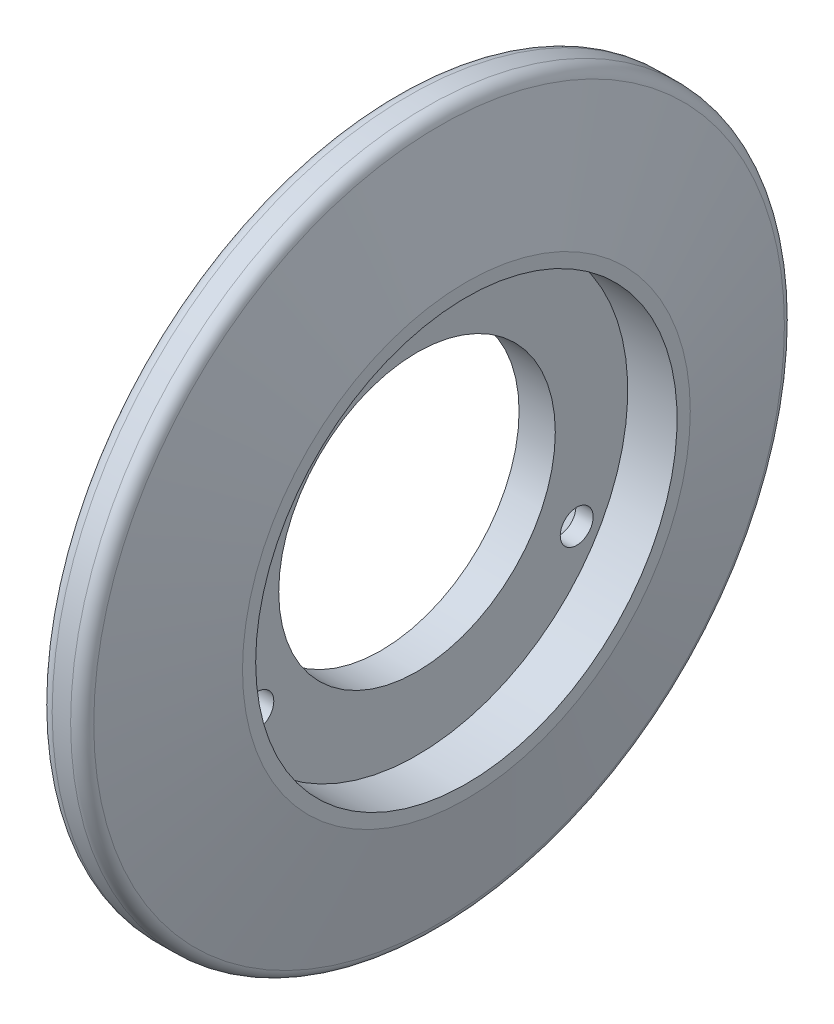
ISO-10303-21;
HEADER;
FILE_DESCRIPTION(('STEP AP214'),'2;1');
FILE_NAME('part.step','',(''),(''),'','','');
FILE_SCHEMA(('AUTOMOTIVE_DESIGN { 1 0 10303 214 1 1 1 1 }'));
ENDSEC;
DATA;
#1=APPLICATION_CONTEXT('core data for automotive mechanical design processes');
#2=APPLICATION_PROTOCOL_DEFINITION('international standard','automotive_design',2000,#1);
#3=PRODUCT_CONTEXT('',#1,'mechanical');
#4=PRODUCT('Part','Part','',(#3));
#5=PRODUCT_RELATED_PRODUCT_CATEGORY('part','',(#4));
#6=PRODUCT_DEFINITION_FORMATION('','',#4);
#7=PRODUCT_DEFINITION_CONTEXT('part definition',#1,'design');
#8=PRODUCT_DEFINITION('design','',#6,#7);
#9=PRODUCT_DEFINITION_SHAPE('','',#8);
#10=(LENGTH_UNIT() NAMED_UNIT(*) SI_UNIT(.MILLI.,.METRE.));
#11=(NAMED_UNIT(*) PLANE_ANGLE_UNIT() SI_UNIT($,.RADIAN.));
#12=(NAMED_UNIT(*) SI_UNIT($,.STERADIAN.) SOLID_ANGLE_UNIT());
#13=UNCERTAINTY_MEASURE_WITH_UNIT(LENGTH_MEASURE(1.E-05),#10,'distance_accuracy_value','');
#14=(GEOMETRIC_REPRESENTATION_CONTEXT(3) GLOBAL_UNCERTAINTY_ASSIGNED_CONTEXT((#13)) GLOBAL_UNIT_ASSIGNED_CONTEXT((#10,
#11,#12)) REPRESENTATION_CONTEXT('',''));
#15=CARTESIAN_POINT('',(0.,0.,0.));
#16=DIRECTION('',(0.,0.,1.));
#17=DIRECTION('',(1.,0.,0.));
#18=AXIS2_PLACEMENT_3D('',#15,#16,#17);
#19=CARTESIAN_POINT('',(5.50000000000002,-33.,0.));
#20=DIRECTION('',(-1.,0.,0.));
#21=DIRECTION('',(0.,0.,1.));
#22=AXIS2_PLACEMENT_3D('',#19,#20,#21);
#23=PLANE('',#22);
#24=CARTESIAN_POINT('',(5.50000000000002,0.,0.));
#25=DIRECTION('',(-1.,0.,0.));
#26=DIRECTION('',(0.,0.,1.));
#27=AXIS2_PLACEMENT_3D('',#24,#25,#26);
#28=CIRCLE('',#27,34.);
#29=CARTESIAN_POINT('',(5.50000000000002,0.,34.));
#30=VERTEX_POINT('',#29);
#31=EDGE_CURVE('E98',#30,#30,#28,.T.);
#32=ORIENTED_EDGE('',*,*,#31,.T.);
#33=EDGE_LOOP('',(#32));
#34=FACE_BOUND('',#33,.T.);
#35=CARTESIAN_POINT('',(5.50000000000002,0.,0.));
#36=DIRECTION('',(-1.,0.,0.));
#37=DIRECTION('',(0.,0.,1.));
#38=AXIS2_PLACEMENT_3D('',#35,#36,#37);
#39=CIRCLE('',#38,33.);
#40=CARTESIAN_POINT('',(5.50000000000002,0.,33.));
#41=VERTEX_POINT('',#40);
#42=EDGE_CURVE('E65',#41,#41,#39,.T.);
#43=ORIENTED_EDGE('',*,*,#42,.F.);
#44=EDGE_LOOP('',(#43));
#45=FACE_BOUND('',#44,.T.);
#46=ADVANCED_FACE('F29',(#34,#45),#23,.T.);
#47=CARTESIAN_POINT('',(5.50000000000002,0.,0.));
#48=DIRECTION('',(1.,0.,0.));
#49=DIRECTION('',(0.,0.,-1.));
#50=AXIS2_PLACEMENT_3D('',#47,#48,#49);
#51=CONICAL_SURFACE('',#50,34.,1.34948188444711);
#52=CARTESIAN_POINT('',(9.64878048780489,0.,0.));
#53=DIRECTION('',(-1.,0.,0.));
#54=DIRECTION('',(0.,0.,1.));
#55=AXIS2_PLACEMENT_3D('',#52,#53,#54);
#56=CIRCLE('',#55,52.4390243902439);
#57=CARTESIAN_POINT('',(9.64878048780489,0.,52.4390243902439));
#58=VERTEX_POINT('',#57);
#59=EDGE_CURVE('E11',#58,#58,#56,.T.);
#60=ORIENTED_EDGE('',*,*,#59,.T.);
#61=EDGE_LOOP('',(#60));
#62=FACE_BOUND('',#61,.T.);
#63=ORIENTED_EDGE('',*,*,#31,.F.);
#64=EDGE_LOOP('',(#63));
#65=FACE_BOUND('',#64,.T.);
#66=ADVANCED_FACE('F145',(#62,#65),#51,.T.);
#67=CARTESIAN_POINT('',(-40.,0.,0.));
#68=DIRECTION('',(-1.,0.,0.));
#69=DIRECTION('',(0.,0.,1.));
#70=AXIS2_PLACEMENT_3D('',#67,#68,#69);
#71=CYLINDRICAL_SURFACE('',#70,54.);
#72=CARTESIAN_POINT('',(14.4,0.,0.));
#73=DIRECTION('',(1.,0.,0.));
#74=DIRECTION('',(0.,0.,-1.));
#75=AXIS2_PLACEMENT_3D('',#72,#73,#74);
#76=CIRCLE('',#75,54.);
#77=CARTESIAN_POINT('',(14.4,0.,-54.));
#78=VERTEX_POINT('',#77);
#79=EDGE_CURVE('E104',#78,#78,#76,.F.);
#80=ORIENTED_EDGE('',*,*,#79,.T.);
#81=EDGE_LOOP('',(#80));
#82=FACE_BOUND('',#81,.T.);
#83=CARTESIAN_POINT('',(11.6,0.,0.));
#84=DIRECTION('',(1.,0.,0.));
#85=DIRECTION('',(0.,0.,-1.));
#86=AXIS2_PLACEMENT_3D('',#83,#84,#85);
#87=CIRCLE('',#86,54.);
#88=CARTESIAN_POINT('',(11.6,0.,-54.));
#89=VERTEX_POINT('',#88);
#90=EDGE_CURVE('E101',#89,#89,#87,.T.);
#91=ORIENTED_EDGE('',*,*,#90,.T.);
#92=EDGE_LOOP('',(#91));
#93=FACE_BOUND('',#92,.T.);
#94=ADVANCED_FACE('F139',(#82,#93),#71,.T.);
#95=CARTESIAN_POINT('',(16.,0.,0.));
#96=DIRECTION('',(-1.,0.,0.));
#97=DIRECTION('',(0.,0.,1.));
#98=AXIS2_PLACEMENT_3D('',#95,#96,#97);
#99=CONICAL_SURFACE('',#98,54.,1.34948188444711);
#100=CARTESIAN_POINT('',(16.3512195121951,0.,0.));
#101=DIRECTION('',(1.,0.,0.));
#102=DIRECTION('',(0.,0.,-1.));
#103=AXIS2_PLACEMENT_3D('',#100,#101,#102);
#104=CIRCLE('',#103,52.4390243902439);
#105=CARTESIAN_POINT('',(16.3512195121951,0.,-52.4390243902439));
#106=VERTEX_POINT('',#105);
#107=EDGE_CURVE('E37',#106,#106,#104,.T.);
#108=ORIENTED_EDGE('',*,*,#107,.T.);
#109=EDGE_LOOP('',(#108));
#110=FACE_BOUND('',#109,.T.);
#111=CARTESIAN_POINT('',(20.5,0.,0.));
#112=DIRECTION('',(-1.,0.,0.));
#113=DIRECTION('',(0.,0.,1.));
#114=AXIS2_PLACEMENT_3D('',#111,#112,#113);
#115=CIRCLE('',#114,34.);
#116=CARTESIAN_POINT('',(20.5,0.,34.));
#117=VERTEX_POINT('',#116);
#118=EDGE_CURVE('E95',#117,#117,#115,.T.);
#119=ORIENTED_EDGE('',*,*,#118,.T.);
#120=EDGE_LOOP('',(#119));
#121=FACE_BOUND('',#120,.T.);
#122=ADVANCED_FACE('F134',(#110,#121),#99,.T.);
#123=CARTESIAN_POINT('',(20.5,-34.,0.));
#124=DIRECTION('',(1.,0.,0.));
#125=DIRECTION('',(0.,0.,-1.));
#126=AXIS2_PLACEMENT_3D('',#123,#124,#125);
#127=PLANE('',#126);
#128=CARTESIAN_POINT('',(20.5,0.,0.));
#129=DIRECTION('',(-1.,0.,0.));
#130=DIRECTION('',(0.,0.,1.));
#131=AXIS2_PLACEMENT_3D('',#128,#129,#130);
#132=CIRCLE('',#131,32.);
#133=CARTESIAN_POINT('',(20.5,0.,32.));
#134=VERTEX_POINT('',#133);
#135=EDGE_CURVE('E92',#134,#134,#132,.T.);
#136=ORIENTED_EDGE('',*,*,#135,.T.);
#137=EDGE_LOOP('',(#136));
#138=FACE_BOUND('',#137,.T.);
#139=ORIENTED_EDGE('',*,*,#118,.F.);
#140=EDGE_LOOP('',(#139));
#141=FACE_BOUND('',#140,.T.);
#142=ADVANCED_FACE('F128',(#138,#141),#127,.T.);
#143=CARTESIAN_POINT('',(-40.,0.,0.));
#144=DIRECTION('',(-1.,0.,0.));
#145=DIRECTION('',(0.,0.,1.));
#146=AXIS2_PLACEMENT_3D('',#143,#144,#145);
#147=CYLINDRICAL_SURFACE('',#146,32.);
#148=CARTESIAN_POINT('',(13.,0.,0.));
#149=DIRECTION('',(-1.,0.,0.));
#150=DIRECTION('',(0.,0.,1.));
#151=AXIS2_PLACEMENT_3D('',#148,#149,#150);
#152=CIRCLE('',#151,32.);
#153=CARTESIAN_POINT('',(13.,0.,32.));
#154=VERTEX_POINT('',#153);
#155=EDGE_CURVE('E89',#154,#154,#152,.T.);
#156=ORIENTED_EDGE('',*,*,#155,.T.);
#157=EDGE_LOOP('',(#156));
#158=FACE_BOUND('',#157,.T.);
#159=ORIENTED_EDGE('',*,*,#135,.F.);
#160=EDGE_LOOP('',(#159));
#161=FACE_BOUND('',#160,.T.);
#162=ADVANCED_FACE('F119',(#158,#161),#147,.F.);
#163=CARTESIAN_POINT('',(13.,-32.,0.));
#164=DIRECTION('',(1.,0.,0.));
#165=DIRECTION('',(0.,0.,-1.));
#166=AXIS2_PLACEMENT_3D('',#163,#164,#165);
#167=PLANE('',#166);
#168=CARTESIAN_POINT('',(13.0000000000001,-13.9999999999998,24.2487113059644));
#169=DIRECTION('',(1.,0.,0.));
#170=DIRECTION('',(0.,0.,-1.));
#171=AXIS2_PLACEMENT_3D('',#168,#169,#170);
#172=CIRCLE('',#171,2.50000000000001);
#173=CARTESIAN_POINT('',(13.0000000000001,-13.9999999999998,21.7487113059644));
#174=VERTEX_POINT('',#173);
#175=EDGE_CURVE('E32',#174,#174,#172,.T.);
#176=ORIENTED_EDGE('',*,*,#175,.F.);
#177=EDGE_LOOP('',(#176));
#178=FACE_BOUND('',#177,.T.);
#179=CARTESIAN_POINT('',(13.,-14.0000000000001,-24.2487113059642));
#180=DIRECTION('',(1.,0.,0.));
#181=DIRECTION('',(0.,0.,-1.));
#182=AXIS2_PLACEMENT_3D('',#179,#180,#181);
#183=CIRCLE('',#182,2.50000000000001);
#184=CARTESIAN_POINT('',(13.,-14.0000000000001,-26.7487113059642));
#185=VERTEX_POINT('',#184);
#186=EDGE_CURVE('E71',#185,#185,#183,.T.);
#187=ORIENTED_EDGE('',*,*,#186,.F.);
#188=EDGE_LOOP('',(#187));
#189=FACE_BOUND('',#188,.T.);
#190=CARTESIAN_POINT('',(13.,28.,0.));
#191=DIRECTION('',(1.,0.,0.));
#192=DIRECTION('',(0.,0.,-1.));
#193=AXIS2_PLACEMENT_3D('',#190,#191,#192);
#194=CIRCLE('',#193,2.50000000000001);
#195=CARTESIAN_POINT('',(13.,28.,-2.50000000000001));
#196=VERTEX_POINT('',#195);
#197=EDGE_CURVE('E74',#196,#196,#194,.T.);
#198=ORIENTED_EDGE('',*,*,#197,.F.);
#199=EDGE_LOOP('',(#198));
#200=FACE_BOUND('',#199,.T.);
#201=CARTESIAN_POINT('',(13.,0.,0.));
#202=DIRECTION('',(-1.,0.,0.));
#203=DIRECTION('',(0.,0.,1.));
#204=AXIS2_PLACEMENT_3D('',#201,#202,#203);
#205=CIRCLE('',#204,21.);
#206=CARTESIAN_POINT('',(13.,0.,21.));
#207=VERTEX_POINT('',#206);
#208=EDGE_CURVE('E86',#207,#207,#205,.T.);
#209=ORIENTED_EDGE('',*,*,#208,.T.);
#210=EDGE_LOOP('',(#209));
#211=FACE_BOUND('',#210,.T.);
#212=ORIENTED_EDGE('',*,*,#155,.F.);
#213=EDGE_LOOP('',(#212));
#214=FACE_BOUND('',#213,.T.);
#215=ADVANCED_FACE('F115',(#178,#189,#200,#211,#214),#167,.T.);
#216=CARTESIAN_POINT('',(-40.,0.,0.));
#217=DIRECTION('',(-1.,0.,0.));
#218=DIRECTION('',(0.,0.,1.));
#219=AXIS2_PLACEMENT_3D('',#216,#217,#218);
#220=CYLINDRICAL_SURFACE('',#219,21.);
#221=CARTESIAN_POINT('',(7.50000000000002,0.,0.));
#222=DIRECTION('',(-1.,0.,0.));
#223=DIRECTION('',(0.,0.,1.));
#224=AXIS2_PLACEMENT_3D('',#221,#222,#223);
#225=CIRCLE('',#224,21.);
#226=CARTESIAN_POINT('',(7.50000000000002,0.,21.));
#227=VERTEX_POINT('',#226);
#228=EDGE_CURVE('E83',#227,#227,#225,.T.);
#229=ORIENTED_EDGE('',*,*,#228,.T.);
#230=EDGE_LOOP('',(#229));
#231=FACE_BOUND('',#230,.T.);
#232=ORIENTED_EDGE('',*,*,#208,.F.);
#233=EDGE_LOOP('',(#232));
#234=FACE_BOUND('',#233,.T.);
#235=ADVANCED_FACE('F118',(#231,#234),#220,.F.);
#236=CARTESIAN_POINT('',(7.50000000000001,-21.,0.));
#237=DIRECTION('',(-1.,0.,0.));
#238=DIRECTION('',(0.,0.,1.));
#239=AXIS2_PLACEMENT_3D('',#236,#237,#238);
#240=PLANE('',#239);
#241=CARTESIAN_POINT('',(7.50000000000002,0.,0.));
#242=DIRECTION('',(-1.,0.,0.));
#243=DIRECTION('',(0.,0.,1.));
#244=AXIS2_PLACEMENT_3D('',#241,#242,#243);
#245=CIRCLE('',#244,33.);
#246=CARTESIAN_POINT('',(7.50000000000002,-16.5000000000001,-28.5788383248864));
#247=VERTEX_POINT('',#246);
#248=CARTESIAN_POINT('',(7.50000000000001,-16.4999999999997,28.5788383248866));
#249=VERTEX_POINT('',#248);
#250=EDGE_CURVE('E64',#247,#249,#245,.T.);
#251=ORIENTED_EDGE('',*,*,#250,.T.);
#252=CARTESIAN_POINT('',(7.50000000000005,-13.9999999999998,24.2487113059644));
#253=DIRECTION('',(-1.,0.,0.));
#254=DIRECTION('',(0.,0.,1.));
#255=AXIS2_PLACEMENT_3D('',#252,#253,#254);
#256=CIRCLE('',#255,5.);
#257=EDGE_CURVE('E43',#249,#249,#256,.T.);
#258=ORIENTED_EDGE('',*,*,#257,.F.);
#259=CARTESIAN_POINT('',(7.50000000000002,33.,0.));
#260=VERTEX_POINT('',#259);
#261=EDGE_CURVE('E54',#249,#260,#245,.T.);
#262=ORIENTED_EDGE('',*,*,#261,.T.);
#263=CARTESIAN_POINT('',(7.50000000000001,28.,0.));
#264=DIRECTION('',(-1.,0.,0.));
#265=DIRECTION('',(0.,0.,1.));
#266=AXIS2_PLACEMENT_3D('',#263,#264,#265);
#267=CIRCLE('',#266,5.);
#268=EDGE_CURVE('E60',#260,#260,#267,.T.);
#269=ORIENTED_EDGE('',*,*,#268,.F.);
#270=EDGE_CURVE('E67',#260,#247,#245,.T.);
#271=ORIENTED_EDGE('',*,*,#270,.T.);
#272=CARTESIAN_POINT('',(7.50000000000001,-14.0000000000001,-24.2487113059642));
#273=DIRECTION('',(-1.,0.,0.));
#274=DIRECTION('',(0.,0.,1.));
#275=AXIS2_PLACEMENT_3D('',#272,#273,#274);
#276=CIRCLE('',#275,5.);
#277=EDGE_CURVE('E48',#247,#247,#276,.T.);
#278=ORIENTED_EDGE('',*,*,#277,.F.);
#279=EDGE_LOOP('',(#251,#258,#262,#269,#271,#278));
#280=FACE_BOUND('',#279,.T.);
#281=ORIENTED_EDGE('',*,*,#228,.F.);
#282=EDGE_LOOP('',(#281));
#283=FACE_BOUND('',#282,.T.);
#284=ADVANCED_FACE('F57',(#280,#283),#240,.T.);
#285=CARTESIAN_POINT('',(-40.,0.,0.));
#286=DIRECTION('',(-1.,0.,0.));
#287=DIRECTION('',(0.,0.,1.));
#288=AXIS2_PLACEMENT_3D('',#285,#286,#287);
#289=CYLINDRICAL_SURFACE('',#288,33.);
#290=ORIENTED_EDGE('',*,*,#42,.T.);
#291=EDGE_LOOP('',(#290));
#292=FACE_BOUND('',#291,.T.);
#293=ORIENTED_EDGE('',*,*,#270,.F.);
#294=ORIENTED_EDGE('',*,*,#261,.F.);
#295=ORIENTED_EDGE('',*,*,#250,.F.);
#296=EDGE_LOOP('',(#293,#294,#295));
#297=FACE_BOUND('',#296,.T.);
#298=ADVANCED_FACE('F158',(#292,#297),#289,.F.);
#299=CARTESIAN_POINT('',(14.4,0.,0.));
#300=DIRECTION('',(1.,0.,0.));
#301=DIRECTION('',(0.,0.,-1.));
#302=AXIS2_PLACEMENT_3D('',#299,#300,#301);
#303=TOROIDAL_SURFACE('',#302,52.,2.);
#304=ORIENTED_EDGE('',*,*,#107,.F.);
#305=EDGE_LOOP('',(#304));
#306=FACE_BOUND('',#305,.T.);
#307=ORIENTED_EDGE('',*,*,#79,.F.);
#308=EDGE_LOOP('',(#307));
#309=FACE_BOUND('',#308,.T.);
#310=ADVANCED_FACE('F160',(#306,#309),#303,.T.);
#311=CARTESIAN_POINT('',(11.6,0.,0.));
#312=DIRECTION('',(1.,0.,0.));
#313=DIRECTION('',(0.,0.,-1.));
#314=AXIS2_PLACEMENT_3D('',#311,#312,#313);
#315=TOROIDAL_SURFACE('',#314,52.,2.);
#316=ORIENTED_EDGE('',*,*,#90,.F.);
#317=EDGE_LOOP('',(#316));
#318=FACE_BOUND('',#317,.T.);
#319=ORIENTED_EDGE('',*,*,#59,.F.);
#320=EDGE_LOOP('',(#319));
#321=FACE_BOUND('',#320,.T.);
#322=ADVANCED_FACE('F194',(#318,#321),#315,.T.);
#323=CARTESIAN_POINT('',(7.50000000000001,28.,0.));
#324=DIRECTION('',(-1.,0.,0.));
#325=DIRECTION('',(0.,0.,1.));
#326=AXIS2_PLACEMENT_3D('',#323,#324,#325);
#327=CYLINDRICAL_SURFACE('',#326,2.50000000000001);
#328=ORIENTED_EDGE('',*,*,#197,.T.);
#329=EDGE_LOOP('',(#328));
#330=FACE_BOUND('',#329,.T.);
#331=CARTESIAN_POINT('',(10.3759210180525,28.,0.));
#332=DIRECTION('',(-1.,0.,0.));
#333=DIRECTION('',(0.,0.,1.));
#334=AXIS2_PLACEMENT_3D('',#331,#332,#333);
#335=CIRCLE('',#334,2.50000000000001);
#336=CARTESIAN_POINT('',(10.3759210180525,28.,2.50000000000001));
#337=VERTEX_POINT('',#336);
#338=EDGE_CURVE('E70',#337,#337,#335,.T.);
#339=ORIENTED_EDGE('',*,*,#338,.T.);
#340=EDGE_LOOP('',(#339));
#341=FACE_BOUND('',#340,.T.);
#342=ADVANCED_FACE('F112',(#330,#341),#327,.F.);
#343=CARTESIAN_POINT('',(7.50000000000001,28.,0.));
#344=DIRECTION('',(-1.,0.,0.));
#345=DIRECTION('',(0.,0.,1.));
#346=AXIS2_PLACEMENT_3D('',#343,#344,#345);
#347=CONICAL_SURFACE('',#346,5.,0.715584993317675);
#348=ORIENTED_EDGE('',*,*,#338,.F.);
#349=EDGE_LOOP('',(#348));
#350=FACE_BOUND('',#349,.T.);
#351=ORIENTED_EDGE('',*,*,#268,.T.);
#352=EDGE_LOOP('',(#351));
#353=FACE_BOUND('',#352,.T.);
#354=ADVANCED_FACE('F69',(#350,#353),#347,.F.);
#355=CARTESIAN_POINT('',(7.50000000000001,-14.0000000000001,-24.2487113059642));
#356=DIRECTION('',(-1.,0.,0.));
#357=DIRECTION('',(0.,0.,1.));
#358=AXIS2_PLACEMENT_3D('',#355,#356,#357);
#359=CYLINDRICAL_SURFACE('',#358,2.50000000000001);
#360=ORIENTED_EDGE('',*,*,#186,.T.);
#361=EDGE_LOOP('',(#360));
#362=FACE_BOUND('',#361,.T.);
#363=CARTESIAN_POINT('',(10.3759210180525,-14.0000000000001,-24.2487113059642));
#364=DIRECTION('',(-1.,0.,0.));
#365=DIRECTION('',(0.,0.,1.));
#366=AXIS2_PLACEMENT_3D('',#363,#364,#365);
#367=CIRCLE('',#366,2.50000000000001);
#368=CARTESIAN_POINT('',(10.3759210180525,-14.0000000000001,-21.7487113059642));
#369=VERTEX_POINT('',#368);
#370=EDGE_CURVE('E77',#369,#369,#367,.T.);
#371=ORIENTED_EDGE('',*,*,#370,.T.);
#372=EDGE_LOOP('',(#371));
#373=FACE_BOUND('',#372,.T.);
#374=ADVANCED_FACE('F184',(#362,#373),#359,.F.);
#375=CARTESIAN_POINT('',(7.50000000000001,-14.0000000000001,-24.2487113059642));
#376=DIRECTION('',(-1.,0.,0.));
#377=DIRECTION('',(0.,0.,1.));
#378=AXIS2_PLACEMENT_3D('',#375,#376,#377);
#379=CONICAL_SURFACE('',#378,5.,0.715584993317675);
#380=ORIENTED_EDGE('',*,*,#370,.F.);
#381=EDGE_LOOP('',(#380));
#382=FACE_BOUND('',#381,.T.);
#383=ORIENTED_EDGE('',*,*,#277,.T.);
#384=EDGE_LOOP('',(#383));
#385=FACE_BOUND('',#384,.T.);
#386=ADVANCED_FACE('F178',(#382,#385),#379,.F.);
#387=CARTESIAN_POINT('',(7.50000000000005,-13.9999999999998,24.2487113059644));
#388=DIRECTION('',(-1.,0.,0.));
#389=DIRECTION('',(0.,0.,1.));
#390=AXIS2_PLACEMENT_3D('',#387,#388,#389);
#391=CYLINDRICAL_SURFACE('',#390,2.50000000000001);
#392=ORIENTED_EDGE('',*,*,#175,.T.);
#393=EDGE_LOOP('',(#392));
#394=FACE_BOUND('',#393,.T.);
#395=CARTESIAN_POINT('',(10.3759210180526,-13.9999999999998,24.2487113059644));
#396=DIRECTION('',(-1.,0.,0.));
#397=DIRECTION('',(0.,0.,1.));
#398=AXIS2_PLACEMENT_3D('',#395,#396,#397);
#399=CIRCLE('',#398,2.50000000000001);
#400=CARTESIAN_POINT('',(10.3759210180526,-13.9999999999998,26.7487113059644));
#401=VERTEX_POINT('',#400);
#402=EDGE_CURVE('E164',#401,#401,#399,.T.);
#403=ORIENTED_EDGE('',*,*,#402,.T.);
#404=EDGE_LOOP('',(#403));
#405=FACE_BOUND('',#404,.T.);
#406=ADVANCED_FACE('F170',(#394,#405),#391,.F.);
#407=CARTESIAN_POINT('',(7.50000000000005,-13.9999999999998,24.2487113059644));
#408=DIRECTION('',(-1.,0.,0.));
#409=DIRECTION('',(0.,0.,1.));
#410=AXIS2_PLACEMENT_3D('',#407,#408,#409);
#411=CONICAL_SURFACE('',#410,5.,0.715584993317675);
#412=ORIENTED_EDGE('',*,*,#402,.F.);
#413=EDGE_LOOP('',(#412));
#414=FACE_BOUND('',#413,.T.);
#415=ORIENTED_EDGE('',*,*,#257,.T.);
#416=EDGE_LOOP('',(#415));
#417=FACE_BOUND('',#416,.T.);
#418=ADVANCED_FACE('F172',(#414,#417),#411,.F.);
#419=CLOSED_SHELL('',(#46,#66,#94,#122,#142,#162,#215,#235,#284,#298,#310,#322,#342,#354,#374,
#386,#406,#418));
#420=MANIFOLD_SOLID_BREP('B2',#419);
#421=ADVANCED_BREP_SHAPE_REPRESENTATION('',(#18,#420),#14);
#422=SHAPE_DEFINITION_REPRESENTATION(#9,#421);
ENDSEC;
END-ISO-10303-21;
